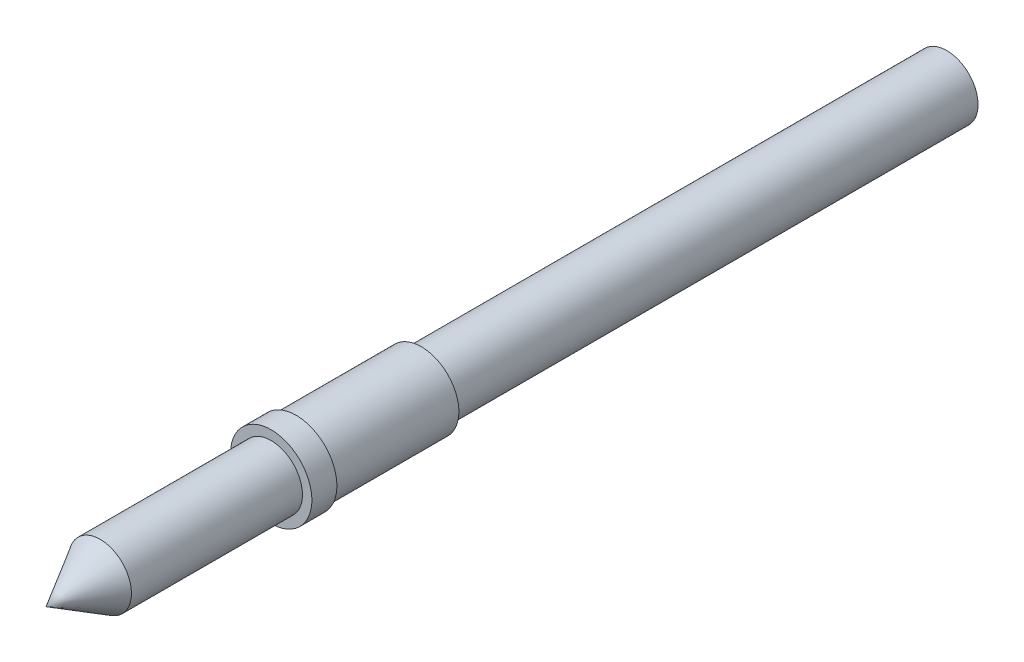
ISO-10303-21;
HEADER;
FILE_DESCRIPTION(('STEP AP214'),'2;1');
FILE_NAME('part.step','',(''),(''),'','','');
FILE_SCHEMA(('AUTOMOTIVE_DESIGN { 1 0 10303 214 1 1 1 1 }'));
ENDSEC;
DATA;
#1=APPLICATION_CONTEXT('core data for automotive mechanical design processes');
#2=APPLICATION_PROTOCOL_DEFINITION('international standard','automotive_design',2000,#1);
#3=PRODUCT_CONTEXT('',#1,'mechanical');
#4=PRODUCT('Part','Part','',(#3));
#5=PRODUCT_RELATED_PRODUCT_CATEGORY('part','',(#4));
#6=PRODUCT_DEFINITION_FORMATION('','',#4);
#7=PRODUCT_DEFINITION_CONTEXT('part definition',#1,'design');
#8=PRODUCT_DEFINITION('design','',#6,#7);
#9=PRODUCT_DEFINITION_SHAPE('','',#8);
#10=(LENGTH_UNIT() NAMED_UNIT(*) SI_UNIT(.MILLI.,.METRE.));
#11=(NAMED_UNIT(*) PLANE_ANGLE_UNIT() SI_UNIT($,.RADIAN.));
#12=(NAMED_UNIT(*) SI_UNIT($,.STERADIAN.) SOLID_ANGLE_UNIT());
#13=UNCERTAINTY_MEASURE_WITH_UNIT(LENGTH_MEASURE(1.E-05),#10,'distance_accuracy_value','');
#14=(GEOMETRIC_REPRESENTATION_CONTEXT(3) GLOBAL_UNCERTAINTY_ASSIGNED_CONTEXT((#13)) GLOBAL_UNIT_ASSIGNED_CONTEXT((#10,
#11,#12)) REPRESENTATION_CONTEXT('',''));
#15=CARTESIAN_POINT('',(0.,0.,0.));
#16=DIRECTION('',(0.,0.,1.));
#17=DIRECTION('',(1.,0.,0.));
#18=AXIS2_PLACEMENT_3D('',#15,#16,#17);
#19=CARTESIAN_POINT('',(0.,0.,0.));
#20=DIRECTION('',(0.,0.,-1.));
#21=DIRECTION('',(-1.,0.,0.));
#22=AXIS2_PLACEMENT_3D('',#19,#20,#21);
#23=CYLINDRICAL_SURFACE('',#22,7.93749999999999);
#24=CARTESIAN_POINT('',(0.,0.,214.851846714922));
#25=DIRECTION('',(0.,0.,-1.));
#26=DIRECTION('',(-1.,0.,0.));
#27=AXIS2_PLACEMENT_3D('',#24,#25,#26);
#28=CIRCLE('',#27,7.93749999999998);
#29=CARTESIAN_POINT('',(-7.93749999999998,0.,214.851846714922));
#30=VERTEX_POINT('',#29);
#31=EDGE_CURVE('E11',#30,#30,#28,.T.);
#32=ORIENTED_EDGE('',*,*,#31,.T.);
#33=EDGE_LOOP('',(#32));
#34=FACE_BOUND('',#33,.T.);
#35=CARTESIAN_POINT('',(0.,0.,171.45));
#36=DIRECTION('',(0.,0.,-1.));
#37=DIRECTION('',(-1.,0.,0.));
#38=AXIS2_PLACEMENT_3D('',#35,#36,#37);
#39=CIRCLE('',#38,7.93749999999999);
#40=CARTESIAN_POINT('',(-7.93749999999999,0.,171.45));
#41=VERTEX_POINT('',#40);
#42=EDGE_CURVE('E52',#41,#41,#39,.T.);
#43=ORIENTED_EDGE('',*,*,#42,.F.);
#44=EDGE_LOOP('',(#43));
#45=FACE_BOUND('',#44,.T.);
#46=ADVANCED_FACE('F33',(#34,#45),#23,.T.);
#47=CARTESIAN_POINT('',(0.,0.,214.851846714922));
#48=DIRECTION('',(0.,0.,-1.));
#49=DIRECTION('',(-1.,0.,0.));
#50=AXIS2_PLACEMENT_3D('',#47,#48,#49);
#51=CONICAL_SURFACE('',#50,7.93749999999998,0.523598775598293);
#52=CARTESIAN_POINT('',(0.,0.,228.6));
#53=VERTEX_POINT('',#52);
#54=VERTEX_LOOP('',#53);
#55=FACE_BOUND('',#54,.T.);
#56=ORIENTED_EDGE('',*,*,#31,.F.);
#57=EDGE_LOOP('',(#56));
#58=FACE_BOUND('',#57,.T.);
#59=ADVANCED_FACE('F42',(#55,#58),#51,.T.);
#60=CARTESIAN_POINT('',(0.,7.9375,0.));
#61=DIRECTION('',(0.,0.,-1.));
#62=DIRECTION('',(-1.,0.,0.));
#63=AXIS2_PLACEMENT_3D('',#60,#61,#62);
#64=PLANE('',#63);
#65=CARTESIAN_POINT('',(0.,0.,0.));
#66=DIRECTION('',(0.,0.,-1.));
#67=DIRECTION('',(-1.,0.,0.));
#68=AXIS2_PLACEMENT_3D('',#65,#66,#67);
#69=CIRCLE('',#68,7.9375);
#70=CARTESIAN_POINT('',(-7.9375,0.,0.));
#71=VERTEX_POINT('',#70);
#72=EDGE_CURVE('E39',#71,#71,#69,.T.);
#73=ORIENTED_EDGE('',*,*,#72,.T.);
#74=EDGE_LOOP('',(#73));
#75=FACE_BOUND('',#74,.T.);
#76=ADVANCED_FACE('F45',(#75),#64,.T.);
#77=CARTESIAN_POINT('',(0.,0.,0.));
#78=DIRECTION('',(0.,0.,-1.));
#79=DIRECTION('',(-1.,0.,0.));
#80=AXIS2_PLACEMENT_3D('',#77,#78,#79);
#81=CYLINDRICAL_SURFACE('',#80,7.9375);
#82=CARTESIAN_POINT('',(0.,0.,133.35));
#83=DIRECTION('',(0.,0.,-1.));
#84=DIRECTION('',(-1.,0.,0.));
#85=AXIS2_PLACEMENT_3D('',#82,#83,#84);
#86=CIRCLE('',#85,7.9375);
#87=CARTESIAN_POINT('',(-7.9375,0.,133.35));
#88=VERTEX_POINT('',#87);
#89=EDGE_CURVE('E68',#88,#88,#86,.T.);
#90=ORIENTED_EDGE('',*,*,#89,.T.);
#91=EDGE_LOOP('',(#90));
#92=FACE_BOUND('',#91,.T.);
#93=ORIENTED_EDGE('',*,*,#72,.F.);
#94=EDGE_LOOP('',(#93));
#95=FACE_BOUND('',#94,.T.);
#96=ADVANCED_FACE('F74',(#92,#95),#81,.T.);
#97=CARTESIAN_POINT('',(0.,9.52499999999999,133.35));
#98=DIRECTION('',(0.,0.,-1.));
#99=DIRECTION('',(-1.,0.,0.));
#100=AXIS2_PLACEMENT_3D('',#97,#98,#99);
#101=PLANE('',#100);
#102=CARTESIAN_POINT('',(0.,0.,133.35));
#103=DIRECTION('',(0.,0.,-1.));
#104=DIRECTION('',(-1.,0.,0.));
#105=AXIS2_PLACEMENT_3D('',#102,#103,#104);
#106=CIRCLE('',#105,9.52499999999999);
#107=CARTESIAN_POINT('',(-9.52499999999999,0.,133.35));
#108=VERTEX_POINT('',#107);
#109=EDGE_CURVE('E65',#108,#108,#106,.T.);
#110=ORIENTED_EDGE('',*,*,#109,.T.);
#111=EDGE_LOOP('',(#110));
#112=FACE_BOUND('',#111,.T.);
#113=ORIENTED_EDGE('',*,*,#89,.F.);
#114=EDGE_LOOP('',(#113));
#115=FACE_BOUND('',#114,.T.);
#116=ADVANCED_FACE('F76',(#112,#115),#101,.T.);
#117=CARTESIAN_POINT('',(0.,0.,0.));
#118=DIRECTION('',(0.,0.,-1.));
#119=DIRECTION('',(-1.,0.,0.));
#120=AXIS2_PLACEMENT_3D('',#117,#118,#119);
#121=CYLINDRICAL_SURFACE('',#120,9.52499999999999);
#122=CARTESIAN_POINT('',(0.,0.,165.1));
#123=DIRECTION('',(0.,0.,-1.));
#124=DIRECTION('',(-1.,0.,0.));
#125=AXIS2_PLACEMENT_3D('',#122,#123,#124);
#126=CIRCLE('',#125,9.52499999999999);
#127=CARTESIAN_POINT('',(-9.52499999999999,0.,165.1));
#128=VERTEX_POINT('',#127);
#129=EDGE_CURVE('E62',#128,#128,#126,.T.);
#130=ORIENTED_EDGE('',*,*,#129,.T.);
#131=EDGE_LOOP('',(#130));
#132=FACE_BOUND('',#131,.T.);
#133=ORIENTED_EDGE('',*,*,#109,.F.);
#134=EDGE_LOOP('',(#133));
#135=FACE_BOUND('',#134,.T.);
#136=ADVANCED_FACE('F83',(#132,#135),#121,.T.);
#137=CARTESIAN_POINT('',(0.,10.31875,165.1));
#138=DIRECTION('',(0.,0.,-1.));
#139=DIRECTION('',(-1.,0.,0.));
#140=AXIS2_PLACEMENT_3D('',#137,#138,#139);
#141=PLANE('',#140);
#142=CARTESIAN_POINT('',(0.,0.,165.1));
#143=DIRECTION('',(0.,0.,-1.));
#144=DIRECTION('',(-1.,0.,0.));
#145=AXIS2_PLACEMENT_3D('',#142,#143,#144);
#146=CIRCLE('',#145,10.31875);
#147=CARTESIAN_POINT('',(-10.31875,0.,165.1));
#148=VERTEX_POINT('',#147);
#149=EDGE_CURVE('E57',#148,#148,#146,.T.);
#150=ORIENTED_EDGE('',*,*,#149,.T.);
#151=EDGE_LOOP('',(#150));
#152=FACE_BOUND('',#151,.T.);
#153=ORIENTED_EDGE('',*,*,#129,.F.);
#154=EDGE_LOOP('',(#153));
#155=FACE_BOUND('',#154,.T.);
#156=ADVANCED_FACE('F90',(#152,#155),#141,.T.);
#157=CARTESIAN_POINT('',(0.,0.,0.));
#158=DIRECTION('',(0.,0.,-1.));
#159=DIRECTION('',(-1.,0.,0.));
#160=AXIS2_PLACEMENT_3D('',#157,#158,#159);
#161=CYLINDRICAL_SURFACE('',#160,10.31875);
#162=CARTESIAN_POINT('',(0.,0.,171.45));
#163=DIRECTION('',(0.,0.,-1.));
#164=DIRECTION('',(-1.,0.,0.));
#165=AXIS2_PLACEMENT_3D('',#162,#163,#164);
#166=CIRCLE('',#165,10.31875);
#167=CARTESIAN_POINT('',(-10.31875,0.,171.45));
#168=VERTEX_POINT('',#167);
#169=EDGE_CURVE('E54',#168,#168,#166,.T.);
#170=ORIENTED_EDGE('',*,*,#169,.T.);
#171=EDGE_LOOP('',(#170));
#172=FACE_BOUND('',#171,.T.);
#173=ORIENTED_EDGE('',*,*,#149,.F.);
#174=EDGE_LOOP('',(#173));
#175=FACE_BOUND('',#174,.T.);
#176=ADVANCED_FACE('F94',(#172,#175),#161,.T.);
#177=CARTESIAN_POINT('',(0.,7.93749999999999,171.45));
#178=DIRECTION('',(0.,0.,1.));
#179=DIRECTION('',(1.,0.,0.));
#180=AXIS2_PLACEMENT_3D('',#177,#178,#179);
#181=PLANE('',#180);
#182=ORIENTED_EDGE('',*,*,#42,.T.);
#183=EDGE_LOOP('',(#182));
#184=FACE_BOUND('',#183,.T.);
#185=ORIENTED_EDGE('',*,*,#169,.F.);
#186=EDGE_LOOP('',(#185));
#187=FACE_BOUND('',#186,.T.);
#188=ADVANCED_FACE('F98',(#184,#187),#181,.T.);
#189=CLOSED_SHELL('',(#46,#59,#76,#96,#116,#136,#156,#176,#188));
#190=MANIFOLD_SOLID_BREP('B2',#189);
#191=ADVANCED_BREP_SHAPE_REPRESENTATION('',(#18,#190),#14);
#192=SHAPE_DEFINITION_REPRESENTATION(#9,#191);
ENDSEC;
END-ISO-10303-21;
